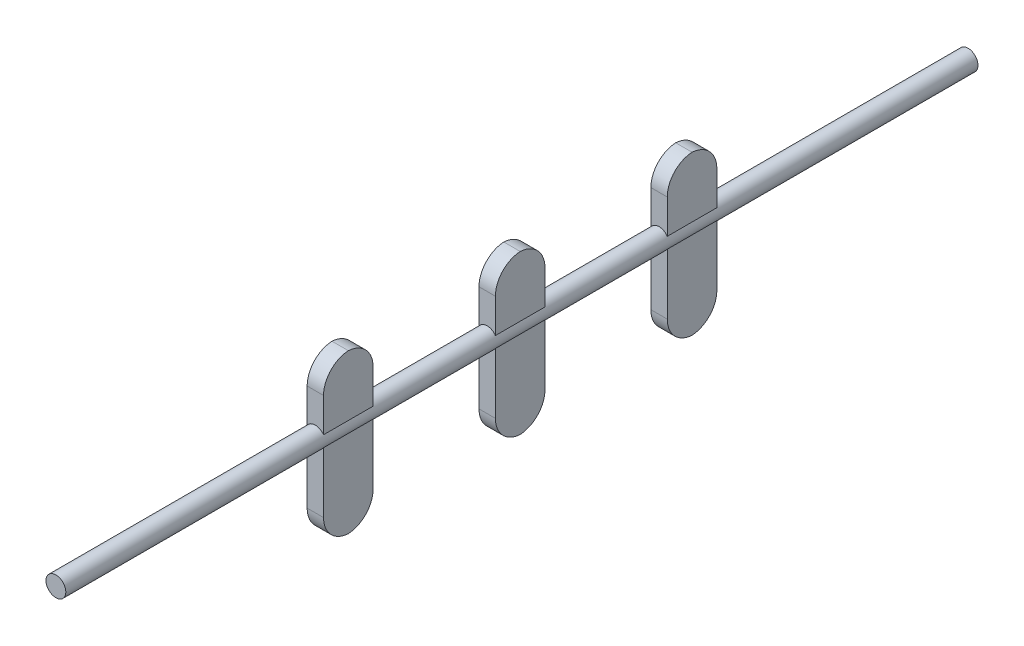
ISO-10303-21;
HEADER;
FILE_DESCRIPTION(('STEP AP214'),'2;1');
FILE_NAME('part.step','',(''),(''),'','','');
FILE_SCHEMA(('AUTOMOTIVE_DESIGN { 1 0 10303 214 1 1 1 1 }'));
ENDSEC;
DATA;
#1=APPLICATION_CONTEXT('core data for automotive mechanical design processes');
#2=APPLICATION_PROTOCOL_DEFINITION('international standard','automotive_design',2000,#1);
#3=PRODUCT_CONTEXT('',#1,'mechanical');
#4=PRODUCT('Part','Part','',(#3));
#5=PRODUCT_RELATED_PRODUCT_CATEGORY('part','',(#4));
#6=PRODUCT_DEFINITION_FORMATION('','',#4);
#7=PRODUCT_DEFINITION_CONTEXT('part definition',#1,'design');
#8=PRODUCT_DEFINITION('design','',#6,#7);
#9=PRODUCT_DEFINITION_SHAPE('','',#8);
#10=(LENGTH_UNIT() NAMED_UNIT(*) SI_UNIT(.MILLI.,.METRE.));
#11=(NAMED_UNIT(*) PLANE_ANGLE_UNIT() SI_UNIT($,.RADIAN.));
#12=(NAMED_UNIT(*) SI_UNIT($,.STERADIAN.) SOLID_ANGLE_UNIT());
#13=UNCERTAINTY_MEASURE_WITH_UNIT(LENGTH_MEASURE(1.E-05),#10,'distance_accuracy_value','');
#14=(GEOMETRIC_REPRESENTATION_CONTEXT(3) GLOBAL_UNCERTAINTY_ASSIGNED_CONTEXT((#13)) GLOBAL_UNIT_ASSIGNED_CONTEXT((#10,
#11,#12)) REPRESENTATION_CONTEXT('',''));
#15=CARTESIAN_POINT('',(0.,0.,0.));
#16=DIRECTION('',(0.,0.,1.));
#17=DIRECTION('',(1.,0.,0.));
#18=AXIS2_PLACEMENT_3D('',#15,#16,#17);
#19=CARTESIAN_POINT('',(0.,0.,438.15));
#20=DIRECTION('',(0.,0.,-1.));
#21=DIRECTION('',(-1.,0.,0.));
#22=AXIS2_PLACEMENT_3D('',#19,#20,#21);
#23=CYLINDRICAL_SURFACE('',#22,4.7625);
#24=DIRECTION('',(0.,0.,-1.));
#25=VECTOR('',#24,1.);
#26=CARTESIAN_POINT('',(-3.93682653404426,2.68007520246076,438.15));
#27=LINE('',#26,#25);
#28=CARTESIAN_POINT('',(-3.93682653404426,2.68007520246076,313.53125));
#29=VERTEX_POINT('',#28);
#30=CARTESIAN_POINT('',(-3.93682653404426,2.68007520246076,289.71875));
#31=VERTEX_POINT('',#30);
#32=EDGE_CURVE('E243',#29,#31,#27,.T.);
#33=ORIENTED_EDGE('',*,*,#32,.T.);
#34=CARTESIAN_POINT('',(0.,0.,289.71875));
#35=DIRECTION('',(0.,0.,-1.));
#36=DIRECTION('',(-1.,0.,0.));
#37=AXIS2_PLACEMENT_3D('',#34,#35,#36);
#38=CIRCLE('',#37,4.7625);
#39=CARTESIAN_POINT('',(3.93682653404426,2.68007520246076,289.71875));
#40=VERTEX_POINT('',#39);
#41=EDGE_CURVE('E238',#31,#40,#38,.T.);
#42=ORIENTED_EDGE('',*,*,#41,.T.);
#43=DIRECTION('',(0.,0.,-1.));
#44=VECTOR('',#43,1.);
#45=CARTESIAN_POINT('',(3.93682653404426,2.68007520246076,438.15));
#46=LINE('',#45,#44);
#47=CARTESIAN_POINT('',(3.93682653404426,2.68007520246076,313.53125));
#48=VERTEX_POINT('',#47);
#49=EDGE_CURVE('E231',#40,#48,#46,.F.);
#50=ORIENTED_EDGE('',*,*,#49,.T.);
#51=CARTESIAN_POINT('',(0.,0.,313.53125));
#52=DIRECTION('',(0.,0.,-1.));
#53=DIRECTION('',(-1.,0.,0.));
#54=AXIS2_PLACEMENT_3D('',#51,#52,#53);
#55=CIRCLE('',#54,4.7625);
#56=EDGE_CURVE('E235',#29,#48,#55,.T.);
#57=ORIENTED_EDGE('',*,*,#56,.F.);
#58=EDGE_LOOP('',(#33,#42,#50,#57));
#59=FACE_BOUND('',#58,.T.);
#60=DIRECTION('',(0.,0.,-1.));
#61=VECTOR('',#60,1.);
#62=CARTESIAN_POINT('',(3.93682653404426,-2.68007520246076,438.15));
#63=LINE('',#62,#61);
#64=CARTESIAN_POINT('',(3.93682653404426,-2.68007520246076,313.53125));
#65=VERTEX_POINT('',#64);
#66=CARTESIAN_POINT('',(3.93682653404426,-2.68007520246076,289.71875));
#67=VERTEX_POINT('',#66);
#68=EDGE_CURVE('E340',#65,#67,#63,.T.);
#69=ORIENTED_EDGE('',*,*,#68,.T.);
#70=CARTESIAN_POINT('',(-3.93682653404426,-2.68007520246076,289.71875));
#71=VERTEX_POINT('',#70);
#72=EDGE_CURVE('E252',#67,#71,#38,.T.);
#73=ORIENTED_EDGE('',*,*,#72,.T.);
#74=DIRECTION('',(0.,0.,-1.));
#75=VECTOR('',#74,1.);
#76=CARTESIAN_POINT('',(-3.93682653404426,-2.68007520246076,438.15));
#77=LINE('',#76,#75);
#78=CARTESIAN_POINT('',(-3.93682653404426,-2.68007520246076,313.53125));
#79=VERTEX_POINT('',#78);
#80=EDGE_CURVE('E338',#71,#79,#77,.F.);
#81=ORIENTED_EDGE('',*,*,#80,.T.);
#82=EDGE_CURVE('E254',#65,#79,#55,.T.);
#83=ORIENTED_EDGE('',*,*,#82,.F.);
#84=EDGE_LOOP('',(#69,#73,#81,#83));
#85=FACE_BOUND('',#84,.T.);
#86=DIRECTION('',(0.,0.,-1.));
#87=VECTOR('',#86,1.);
#88=CARTESIAN_POINT('',(-3.93682653404426,2.68007520246076,438.15));
#89=LINE('',#88,#87);
#90=CARTESIAN_POINT('',(-3.93682653404426,2.68007520246076,148.43125));
#91=VERTEX_POINT('',#90);
#92=CARTESIAN_POINT('',(-3.93682653404426,2.68007520246076,124.61875));
#93=VERTEX_POINT('',#92);
#94=EDGE_CURVE('E332',#91,#93,#89,.T.);
#95=ORIENTED_EDGE('',*,*,#94,.T.);
#96=CARTESIAN_POINT('',(0.,0.,124.61875));
#97=DIRECTION('',(0.,0.,-1.));
#98=DIRECTION('',(-1.,0.,0.));
#99=AXIS2_PLACEMENT_3D('',#96,#97,#98);
#100=CIRCLE('',#99,4.7625);
#101=CARTESIAN_POINT('',(3.93682653404426,2.68007520246076,124.61875));
#102=VERTEX_POINT('',#101);
#103=EDGE_CURVE('E331',#93,#102,#100,.T.);
#104=ORIENTED_EDGE('',*,*,#103,.T.);
#105=DIRECTION('',(0.,0.,-1.));
#106=VECTOR('',#105,1.);
#107=CARTESIAN_POINT('',(3.93682653404426,2.68007520246076,438.15));
#108=LINE('',#107,#106);
#109=CARTESIAN_POINT('',(3.93682653404426,2.68007520246076,148.43125));
#110=VERTEX_POINT('',#109);
#111=EDGE_CURVE('E335',#102,#110,#108,.F.);
#112=ORIENTED_EDGE('',*,*,#111,.T.);
#113=CARTESIAN_POINT('',(0.,0.,148.43125));
#114=DIRECTION('',(0.,0.,-1.));
#115=DIRECTION('',(-1.,0.,0.));
#116=AXIS2_PLACEMENT_3D('',#113,#114,#115);
#117=CIRCLE('',#116,4.7625);
#118=EDGE_CURVE('E324',#91,#110,#117,.T.);
#119=ORIENTED_EDGE('',*,*,#118,.F.);
#120=EDGE_LOOP('',(#95,#104,#112,#119));
#121=FACE_BOUND('',#120,.T.);
#122=DIRECTION('',(0.,0.,-1.));
#123=VECTOR('',#122,1.);
#124=CARTESIAN_POINT('',(3.93682653404426,-2.68007520246076,438.15));
#125=LINE('',#124,#123);
#126=CARTESIAN_POINT('',(3.93682653404426,-2.68007520246076,148.43125));
#127=VERTEX_POINT('',#126);
#128=CARTESIAN_POINT('',(3.93682653404426,-2.68007520246076,124.61875));
#129=VERTEX_POINT('',#128);
#130=EDGE_CURVE('E326',#127,#129,#125,.T.);
#131=ORIENTED_EDGE('',*,*,#130,.T.);
#132=CARTESIAN_POINT('',(-3.93682653404426,-2.68007520246076,124.61875));
#133=VERTEX_POINT('',#132);
#134=EDGE_CURVE('E329',#129,#133,#100,.T.);
#135=ORIENTED_EDGE('',*,*,#134,.T.);
#136=DIRECTION('',(0.,0.,-1.));
#137=VECTOR('',#136,1.);
#138=CARTESIAN_POINT('',(-3.93682653404426,-2.68007520246076,438.15));
#139=LINE('',#138,#137);
#140=CARTESIAN_POINT('',(-3.93682653404426,-2.68007520246076,148.43125));
#141=VERTEX_POINT('',#140);
#142=EDGE_CURVE('E323',#133,#141,#139,.F.);
#143=ORIENTED_EDGE('',*,*,#142,.T.);
#144=EDGE_CURVE('E320',#127,#141,#117,.T.);
#145=ORIENTED_EDGE('',*,*,#144,.F.);
#146=EDGE_LOOP('',(#131,#135,#143,#145));
#147=FACE_BOUND('',#146,.T.);
#148=DIRECTION('',(0.,0.,-1.));
#149=VECTOR('',#148,1.);
#150=CARTESIAN_POINT('',(-3.93682653404426,2.68007520246076,438.15));
#151=LINE('',#150,#149);
#152=CARTESIAN_POINT('',(-3.93682653404426,2.68007520246076,230.98125));
#153=VERTEX_POINT('',#152);
#154=CARTESIAN_POINT('',(-3.93682653404426,2.68007520246076,207.16875));
#155=VERTEX_POINT('',#154);
#156=EDGE_CURVE('E315',#153,#155,#151,.T.);
#157=ORIENTED_EDGE('',*,*,#156,.T.);
#158=CARTESIAN_POINT('',(0.,0.,207.16875));
#159=DIRECTION('',(0.,0.,-1.));
#160=DIRECTION('',(-1.,0.,0.));
#161=AXIS2_PLACEMENT_3D('',#158,#159,#160);
#162=CIRCLE('',#161,4.7625);
#163=CARTESIAN_POINT('',(3.93682653404426,2.68007520246076,207.16875));
#164=VERTEX_POINT('',#163);
#165=EDGE_CURVE('E314',#155,#164,#162,.T.);
#166=ORIENTED_EDGE('',*,*,#165,.T.);
#167=DIRECTION('',(0.,0.,-1.));
#168=VECTOR('',#167,1.);
#169=CARTESIAN_POINT('',(3.93682653404426,2.68007520246076,438.15));
#170=LINE('',#169,#168);
#171=CARTESIAN_POINT('',(3.93682653404426,2.68007520246076,230.98125));
#172=VERTEX_POINT('',#171);
#173=EDGE_CURVE('E318',#164,#172,#170,.F.);
#174=ORIENTED_EDGE('',*,*,#173,.T.);
#175=CARTESIAN_POINT('',(0.,0.,230.98125));
#176=DIRECTION('',(0.,0.,-1.));
#177=DIRECTION('',(-1.,0.,0.));
#178=AXIS2_PLACEMENT_3D('',#175,#176,#177);
#179=CIRCLE('',#178,4.7625);
#180=EDGE_CURVE('E307',#153,#172,#179,.T.);
#181=ORIENTED_EDGE('',*,*,#180,.F.);
#182=EDGE_LOOP('',(#157,#166,#174,#181));
#183=FACE_BOUND('',#182,.T.);
#184=DIRECTION('',(0.,0.,-1.));
#185=VECTOR('',#184,1.);
#186=CARTESIAN_POINT('',(3.93682653404426,-2.68007520246076,438.15));
#187=LINE('',#186,#185);
#188=CARTESIAN_POINT('',(3.93682653404426,-2.68007520246076,230.98125));
#189=VERTEX_POINT('',#188);
#190=CARTESIAN_POINT('',(3.93682653404426,-2.68007520246076,207.16875));
#191=VERTEX_POINT('',#190);
#192=EDGE_CURVE('E309',#189,#191,#187,.T.);
#193=ORIENTED_EDGE('',*,*,#192,.T.);
#194=CARTESIAN_POINT('',(-3.93682653404426,-2.68007520246076,207.16875));
#195=VERTEX_POINT('',#194);
#196=EDGE_CURVE('E312',#191,#195,#162,.T.);
#197=ORIENTED_EDGE('',*,*,#196,.T.);
#198=DIRECTION('',(0.,0.,-1.));
#199=VECTOR('',#198,1.);
#200=CARTESIAN_POINT('',(-3.93682653404426,-2.68007520246076,438.15));
#201=LINE('',#200,#199);
#202=CARTESIAN_POINT('',(-3.93682653404426,-2.68007520246076,230.98125));
#203=VERTEX_POINT('',#202);
#204=EDGE_CURVE('E306',#195,#203,#201,.F.);
#205=ORIENTED_EDGE('',*,*,#204,.T.);
#206=EDGE_CURVE('E301',#189,#203,#179,.T.);
#207=ORIENTED_EDGE('',*,*,#206,.F.);
#208=EDGE_LOOP('',(#193,#197,#205,#207));
#209=FACE_BOUND('',#208,.T.);
#210=CARTESIAN_POINT('',(0.,0.,438.15));
#211=DIRECTION('',(0.,0.,1.));
#212=DIRECTION('',(1.,0.,0.));
#213=AXIS2_PLACEMENT_3D('',#210,#211,#212);
#214=CIRCLE('',#213,4.7625);
#215=CARTESIAN_POINT('',(4.7625,0.,438.15));
#216=VERTEX_POINT('',#215);
#217=EDGE_CURVE('E298',#216,#216,#214,.T.);
#218=ORIENTED_EDGE('',*,*,#217,.F.);
#219=EDGE_LOOP('',(#218));
#220=FACE_BOUND('',#219,.T.);
#221=CARTESIAN_POINT('',(0.,0.,0.));
#222=DIRECTION('',(0.,0.,1.));
#223=DIRECTION('',(1.,0.,0.));
#224=AXIS2_PLACEMENT_3D('',#221,#222,#223);
#225=CIRCLE('',#224,4.7625);
#226=CARTESIAN_POINT('',(4.7625,0.,0.));
#227=VERTEX_POINT('',#226);
#228=EDGE_CURVE('E297',#227,#227,#225,.T.);
#229=ORIENTED_EDGE('',*,*,#228,.T.);
#230=EDGE_LOOP('',(#229));
#231=FACE_BOUND('',#230,.T.);
#232=ADVANCED_FACE('F35',(#59,#85,#121,#147,#183,#209,#220,#231),#23,.T.);
#233=CARTESIAN_POINT('',(0.,0.,438.15));
#234=DIRECTION('',(0.,0.,1.));
#235=DIRECTION('',(1.,0.,0.));
#236=AXIS2_PLACEMENT_3D('',#233,#234,#235);
#237=PLANE('',#236);
#238=ORIENTED_EDGE('',*,*,#217,.T.);
#239=EDGE_LOOP('',(#238));
#240=FACE_BOUND('',#239,.T.);
#241=ADVANCED_FACE('F468',(#240),#237,.T.);
#242=CARTESIAN_POINT('',(0.,0.,0.));
#243=DIRECTION('',(0.,0.,1.));
#244=DIRECTION('',(1.,0.,0.));
#245=AXIS2_PLACEMENT_3D('',#242,#243,#244);
#246=PLANE('',#245);
#247=ORIENTED_EDGE('',*,*,#228,.F.);
#248=EDGE_LOOP('',(#247));
#249=FACE_BOUND('',#248,.T.);
#250=ADVANCED_FACE('F473',(#249),#246,.F.);
#251=CARTESIAN_POINT('',(0.,0.,230.98125));
#252=DIRECTION('',(0.,0.,-1.));
#253=DIRECTION('',(-1.,0.,0.));
#254=AXIS2_PLACEMENT_3D('',#251,#252,#253);
#255=PLANE('',#254);
#256=DIRECTION('',(0.,-1.,0.));
#257=VECTOR('',#256,1.);
#258=CARTESIAN_POINT('',(-3.93682653404426,-44.45,230.98125));
#259=LINE('',#258,#257);
#260=CARTESIAN_POINT('',(-3.93682653404426,-31.75,230.98125));
#261=VERTEX_POINT('',#260);
#262=EDGE_CURVE('E288',#203,#261,#259,.T.);
#263=ORIENTED_EDGE('',*,*,#262,.T.);
#264=DIRECTION('',(1.,0.,0.));
#265=VECTOR('',#264,1.);
#266=CARTESIAN_POINT('',(3.93682653404426,-31.75,230.98125));
#267=LINE('',#266,#265);
#268=CARTESIAN_POINT('',(3.93682653404426,-31.75,230.98125));
#269=VERTEX_POINT('',#268);
#270=EDGE_CURVE('E399',#261,#269,#267,.T.);
#271=ORIENTED_EDGE('',*,*,#270,.T.);
#272=DIRECTION('',(0.,1.,0.));
#273=VECTOR('',#272,1.);
#274=CARTESIAN_POINT('',(3.93682653404426,-44.45,230.98125));
#275=LINE('',#274,#273);
#276=EDGE_CURVE('E286',#269,#189,#275,.T.);
#277=ORIENTED_EDGE('',*,*,#276,.T.);
#278=ORIENTED_EDGE('',*,*,#206,.T.);
#279=EDGE_LOOP('',(#263,#271,#277,#278));
#280=FACE_BOUND('',#279,.T.);
#281=ADVANCED_FACE('F684',(#280),#255,.F.);
#282=CARTESIAN_POINT('',(0.,0.,207.16875));
#283=DIRECTION('',(0.,0.,-1.));
#284=DIRECTION('',(-1.,0.,0.));
#285=AXIS2_PLACEMENT_3D('',#282,#283,#284);
#286=PLANE('',#285);
#287=DIRECTION('',(0.,1.,0.));
#288=VECTOR('',#287,1.);
#289=CARTESIAN_POINT('',(3.93682653404426,-44.45,207.16875));
#290=LINE('',#289,#288);
#291=CARTESIAN_POINT('',(3.93682653404426,-31.75,207.16875));
#292=VERTEX_POINT('',#291);
#293=EDGE_CURVE('E292',#292,#191,#290,.T.);
#294=ORIENTED_EDGE('',*,*,#293,.F.);
#295=DIRECTION('',(1.,0.,0.));
#296=VECTOR('',#295,1.);
#297=CARTESIAN_POINT('',(0.,-31.75,207.16875));
#298=LINE('',#297,#296);
#299=CARTESIAN_POINT('',(-3.93682653404426,-31.75,207.16875));
#300=VERTEX_POINT('',#299);
#301=EDGE_CURVE('E416',#292,#300,#298,.F.);
#302=ORIENTED_EDGE('',*,*,#301,.T.);
#303=DIRECTION('',(0.,-1.,0.));
#304=VECTOR('',#303,1.);
#305=CARTESIAN_POINT('',(-3.93682653404426,-44.45,207.16875));
#306=LINE('',#305,#304);
#307=EDGE_CURVE('E294',#195,#300,#306,.T.);
#308=ORIENTED_EDGE('',*,*,#307,.F.);
#309=ORIENTED_EDGE('',*,*,#196,.F.);
#310=EDGE_LOOP('',(#294,#302,#308,#309));
#311=FACE_BOUND('',#310,.T.);
#312=ADVANCED_FACE('F690',(#311),#286,.T.);
#313=CARTESIAN_POINT('',(-3.93682653404426,-44.45,207.16875));
#314=DIRECTION('',(-1.,0.,0.));
#315=DIRECTION('',(0.,0.,1.));
#316=AXIS2_PLACEMENT_3D('',#313,#314,#315);
#317=PLANE('',#316);
#318=CARTESIAN_POINT('',(-3.93682653404426,-31.75,219.86875));
#319=DIRECTION('',(-1.,0.,0.));
#320=DIRECTION('',(0.,0.,1.));
#321=AXIS2_PLACEMENT_3D('',#318,#319,#320);
#322=CIRCLE('',#321,12.7);
#323=CARTESIAN_POINT('',(-3.93682653404426,-44.4251710417454,219.075));
#324=VERTEX_POINT('',#323);
#325=EDGE_CURVE('E412',#300,#324,#322,.T.);
#326=ORIENTED_EDGE('',*,*,#325,.T.);
#327=CARTESIAN_POINT('',(-3.93682653404426,-31.75,218.28125));
#328=DIRECTION('',(-1.,0.,0.));
#329=DIRECTION('',(0.,0.,1.));
#330=AXIS2_PLACEMENT_3D('',#327,#328,#329);
#331=CIRCLE('',#330,12.7);
#332=EDGE_CURVE('E414',#324,#261,#331,.T.);
#333=ORIENTED_EDGE('',*,*,#332,.T.);
#334=ORIENTED_EDGE('',*,*,#262,.F.);
#335=ORIENTED_EDGE('',*,*,#204,.F.);
#336=ORIENTED_EDGE('',*,*,#307,.T.);
#337=EDGE_LOOP('',(#326,#333,#334,#335,#336));
#338=FACE_BOUND('',#337,.T.);
#339=ADVANCED_FACE('F464',(#338),#317,.T.);
#340=CARTESIAN_POINT('',(3.93682653404426,-44.45,207.16875));
#341=DIRECTION('',(1.,0.,0.));
#342=DIRECTION('',(0.,0.,-1.));
#343=AXIS2_PLACEMENT_3D('',#340,#341,#342);
#344=PLANE('',#343);
#345=ORIENTED_EDGE('',*,*,#276,.F.);
#346=CARTESIAN_POINT('',(3.93682653404426,-31.75,218.28125));
#347=DIRECTION('',(1.,0.,0.));
#348=DIRECTION('',(0.,0.,-1.));
#349=AXIS2_PLACEMENT_3D('',#346,#347,#348);
#350=CIRCLE('',#349,12.7);
#351=CARTESIAN_POINT('',(3.93682653404426,-44.4251710417454,219.075));
#352=VERTEX_POINT('',#351);
#353=EDGE_CURVE('E410',#269,#352,#350,.T.);
#354=ORIENTED_EDGE('',*,*,#353,.T.);
#355=CARTESIAN_POINT('',(3.93682653404426,-31.75,219.86875));
#356=DIRECTION('',(1.,0.,0.));
#357=DIRECTION('',(0.,0.,-1.));
#358=AXIS2_PLACEMENT_3D('',#355,#356,#357);
#359=CIRCLE('',#358,12.7);
#360=EDGE_CURVE('E408',#352,#292,#359,.T.);
#361=ORIENTED_EDGE('',*,*,#360,.T.);
#362=ORIENTED_EDGE('',*,*,#293,.T.);
#363=ORIENTED_EDGE('',*,*,#192,.F.);
#364=EDGE_LOOP('',(#345,#354,#361,#362,#363));
#365=FACE_BOUND('',#364,.T.);
#366=ADVANCED_FACE('F457',(#365),#344,.T.);
#367=CARTESIAN_POINT('',(3.93682653404426,19.05,207.16875));
#368=VERTEX_POINT('',#367);
#369=EDGE_CURVE('E291',#164,#368,#290,.T.);
#370=ORIENTED_EDGE('',*,*,#369,.T.);
#371=CARTESIAN_POINT('',(3.93682653404426,19.05,219.86875));
#372=DIRECTION('',(1.,0.,0.));
#373=DIRECTION('',(0.,0.,-1.));
#374=AXIS2_PLACEMENT_3D('',#371,#372,#373);
#375=CIRCLE('',#374,12.7);
#376=CARTESIAN_POINT('',(3.93682653404426,31.7251710417454,219.075));
#377=VERTEX_POINT('',#376);
#378=EDGE_CURVE('E44',#368,#377,#375,.T.);
#379=ORIENTED_EDGE('',*,*,#378,.T.);
#380=CARTESIAN_POINT('',(3.93682653404426,19.05,218.28125));
#381=DIRECTION('',(1.,0.,0.));
#382=DIRECTION('',(0.,0.,-1.));
#383=AXIS2_PLACEMENT_3D('',#380,#381,#382);
#384=CIRCLE('',#383,12.7);
#385=CARTESIAN_POINT('',(3.93682653404426,19.05,230.98125));
#386=VERTEX_POINT('',#385);
#387=EDGE_CURVE('E55',#377,#386,#384,.T.);
#388=ORIENTED_EDGE('',*,*,#387,.T.);
#389=EDGE_CURVE('E285',#172,#386,#275,.T.);
#390=ORIENTED_EDGE('',*,*,#389,.F.);
#391=ORIENTED_EDGE('',*,*,#173,.F.);
#392=EDGE_LOOP('',(#370,#379,#388,#390,#391));
#393=FACE_BOUND('',#392,.T.);
#394=ADVANCED_FACE('F455',(#393),#344,.T.);
#395=CARTESIAN_POINT('',(-3.93682653404426,19.05,218.28125));
#396=DIRECTION('',(-1.,0.,0.));
#397=DIRECTION('',(0.,0.,1.));
#398=AXIS2_PLACEMENT_3D('',#395,#396,#397);
#399=CIRCLE('',#398,12.7);
#400=CARTESIAN_POINT('',(-3.93682653404426,19.05,230.98125));
#401=VERTEX_POINT('',#400);
#402=CARTESIAN_POINT('',(-3.93682653404426,31.7251710417454,219.075));
#403=VERTEX_POINT('',#402);
#404=EDGE_CURVE('E418',#401,#403,#399,.T.);
#405=ORIENTED_EDGE('',*,*,#404,.T.);
#406=CARTESIAN_POINT('',(-3.93682653404426,19.05,219.86875));
#407=DIRECTION('',(-1.,0.,0.));
#408=DIRECTION('',(0.,0.,1.));
#409=AXIS2_PLACEMENT_3D('',#406,#407,#408);
#410=CIRCLE('',#409,12.7);
#411=CARTESIAN_POINT('',(-3.93682653404426,19.05,207.16875));
#412=VERTEX_POINT('',#411);
#413=EDGE_CURVE('E420',#403,#412,#410,.T.);
#414=ORIENTED_EDGE('',*,*,#413,.T.);
#415=EDGE_CURVE('E295',#412,#155,#306,.T.);
#416=ORIENTED_EDGE('',*,*,#415,.T.);
#417=ORIENTED_EDGE('',*,*,#156,.F.);
#418=EDGE_CURVE('E289',#401,#153,#259,.T.);
#419=ORIENTED_EDGE('',*,*,#418,.F.);
#420=EDGE_LOOP('',(#405,#414,#416,#417,#419));
#421=FACE_BOUND('',#420,.T.);
#422=ADVANCED_FACE('F446',(#421),#317,.T.);
#423=ORIENTED_EDGE('',*,*,#415,.F.);
#424=DIRECTION('',(-1.,0.,0.));
#425=VECTOR('',#424,1.);
#426=CARTESIAN_POINT('',(0.,19.05,207.16875));
#427=LINE('',#426,#425);
#428=EDGE_CURVE('E422',#412,#368,#427,.F.);
#429=ORIENTED_EDGE('',*,*,#428,.T.);
#430=ORIENTED_EDGE('',*,*,#369,.F.);
#431=ORIENTED_EDGE('',*,*,#165,.F.);
#432=EDGE_LOOP('',(#423,#429,#430,#431));
#433=FACE_BOUND('',#432,.T.);
#434=ADVANCED_FACE('F454',(#433),#286,.T.);
#435=ORIENTED_EDGE('',*,*,#389,.T.);
#436=DIRECTION('',(-1.,0.,0.));
#437=VECTOR('',#436,1.);
#438=CARTESIAN_POINT('',(-3.93682653404426,19.05,230.98125));
#439=LINE('',#438,#437);
#440=EDGE_CURVE('E11',#386,#401,#439,.T.);
#441=ORIENTED_EDGE('',*,*,#440,.T.);
#442=ORIENTED_EDGE('',*,*,#418,.T.);
#443=ORIENTED_EDGE('',*,*,#180,.T.);
#444=EDGE_LOOP('',(#435,#441,#442,#443));
#445=FACE_BOUND('',#444,.T.);
#446=ADVANCED_FACE('F441',(#445),#255,.F.);
#447=CARTESIAN_POINT('',(0.,0.,148.43125));
#448=DIRECTION('',(0.,0.,-1.));
#449=DIRECTION('',(-1.,0.,0.));
#450=AXIS2_PLACEMENT_3D('',#447,#448,#449);
#451=PLANE('',#450);
#452=DIRECTION('',(0.,-1.,0.));
#453=VECTOR('',#452,1.);
#454=CARTESIAN_POINT('',(-3.93682653404426,-44.45,148.43125));
#455=LINE('',#454,#453);
#456=CARTESIAN_POINT('',(-3.93682653404426,-31.75,148.43125));
#457=VERTEX_POINT('',#456);
#458=EDGE_CURVE('E276',#141,#457,#455,.T.);
#459=ORIENTED_EDGE('',*,*,#458,.T.);
#460=DIRECTION('',(1.,0.,0.));
#461=VECTOR('',#460,1.);
#462=CARTESIAN_POINT('',(3.93682653404426,-31.75,148.43125));
#463=LINE('',#462,#461);
#464=CARTESIAN_POINT('',(3.93682653404426,-31.75,148.43125));
#465=VERTEX_POINT('',#464);
#466=EDGE_CURVE('E345',#457,#465,#463,.T.);
#467=ORIENTED_EDGE('',*,*,#466,.T.);
#468=DIRECTION('',(0.,1.,0.));
#469=VECTOR('',#468,1.);
#470=CARTESIAN_POINT('',(3.93682653404426,-44.45,148.43125));
#471=LINE('',#470,#469);
#472=EDGE_CURVE('E274',#465,#127,#471,.T.);
#473=ORIENTED_EDGE('',*,*,#472,.T.);
#474=ORIENTED_EDGE('',*,*,#144,.T.);
#475=EDGE_LOOP('',(#459,#467,#473,#474));
#476=FACE_BOUND('',#475,.T.);
#477=ADVANCED_FACE('F627',(#476),#451,.F.);
#478=CARTESIAN_POINT('',(0.,0.,124.61875));
#479=DIRECTION('',(0.,0.,-1.));
#480=DIRECTION('',(-1.,0.,0.));
#481=AXIS2_PLACEMENT_3D('',#478,#479,#480);
#482=PLANE('',#481);
#483=DIRECTION('',(0.,1.,0.));
#484=VECTOR('',#483,1.);
#485=CARTESIAN_POINT('',(3.93682653404426,-44.45,124.61875));
#486=LINE('',#485,#484);
#487=CARTESIAN_POINT('',(3.93682653404426,-31.75,124.61875));
#488=VERTEX_POINT('',#487);
#489=EDGE_CURVE('E280',#488,#129,#486,.T.);
#490=ORIENTED_EDGE('',*,*,#489,.F.);
#491=DIRECTION('',(1.,0.,0.));
#492=VECTOR('',#491,1.);
#493=CARTESIAN_POINT('',(0.,-31.75,124.61875));
#494=LINE('',#493,#492);
#495=CARTESIAN_POINT('',(-3.93682653404426,-31.75,124.61875));
#496=VERTEX_POINT('',#495);
#497=EDGE_CURVE('E356',#488,#496,#494,.F.);
#498=ORIENTED_EDGE('',*,*,#497,.T.);
#499=DIRECTION('',(0.,-1.,0.));
#500=VECTOR('',#499,1.);
#501=CARTESIAN_POINT('',(-3.93682653404426,-44.45,124.61875));
#502=LINE('',#501,#500);
#503=EDGE_CURVE('E282',#133,#496,#502,.T.);
#504=ORIENTED_EDGE('',*,*,#503,.F.);
#505=ORIENTED_EDGE('',*,*,#134,.F.);
#506=EDGE_LOOP('',(#490,#498,#504,#505));
#507=FACE_BOUND('',#506,.T.);
#508=ADVANCED_FACE('F636',(#507),#482,.T.);
#509=CARTESIAN_POINT('',(-3.93682653404426,-44.45,124.61875));
#510=DIRECTION('',(-1.,0.,0.));
#511=DIRECTION('',(0.,0.,1.));
#512=AXIS2_PLACEMENT_3D('',#509,#510,#511);
#513=PLANE('',#512);
#514=CARTESIAN_POINT('',(-3.93682653404426,-31.75,137.31875));
#515=DIRECTION('',(-1.,0.,0.));
#516=DIRECTION('',(0.,0.,1.));
#517=AXIS2_PLACEMENT_3D('',#514,#515,#516);
#518=CIRCLE('',#517,12.7);
#519=CARTESIAN_POINT('',(-3.93682653404426,-44.4251710417454,136.525));
#520=VERTEX_POINT('',#519);
#521=EDGE_CURVE('E352',#496,#520,#518,.T.);
#522=ORIENTED_EDGE('',*,*,#521,.T.);
#523=CARTESIAN_POINT('',(-3.93682653404426,-31.75,135.73125));
#524=DIRECTION('',(-1.,0.,0.));
#525=DIRECTION('',(0.,0.,1.));
#526=AXIS2_PLACEMENT_3D('',#523,#524,#525);
#527=CIRCLE('',#526,12.7);
#528=EDGE_CURVE('E354',#520,#457,#527,.T.);
#529=ORIENTED_EDGE('',*,*,#528,.T.);
#530=ORIENTED_EDGE('',*,*,#458,.F.);
#531=ORIENTED_EDGE('',*,*,#142,.F.);
#532=ORIENTED_EDGE('',*,*,#503,.T.);
#533=EDGE_LOOP('',(#522,#529,#530,#531,#532));
#534=FACE_BOUND('',#533,.T.);
#535=ADVANCED_FACE('F645',(#534),#513,.T.);
#536=CARTESIAN_POINT('',(3.93682653404426,-44.45,124.61875));
#537=DIRECTION('',(1.,0.,0.));
#538=DIRECTION('',(0.,0.,-1.));
#539=AXIS2_PLACEMENT_3D('',#536,#537,#538);
#540=PLANE('',#539);
#541=ORIENTED_EDGE('',*,*,#472,.F.);
#542=CARTESIAN_POINT('',(3.93682653404426,-31.75,135.73125));
#543=DIRECTION('',(1.,0.,0.));
#544=DIRECTION('',(0.,0.,-1.));
#545=AXIS2_PLACEMENT_3D('',#542,#543,#544);
#546=CIRCLE('',#545,12.7);
#547=CARTESIAN_POINT('',(3.93682653404426,-44.4251710417454,136.525));
#548=VERTEX_POINT('',#547);
#549=EDGE_CURVE('E350',#465,#548,#546,.T.);
#550=ORIENTED_EDGE('',*,*,#549,.T.);
#551=CARTESIAN_POINT('',(3.93682653404426,-31.75,137.31875));
#552=DIRECTION('',(1.,0.,0.));
#553=DIRECTION('',(0.,0.,-1.));
#554=AXIS2_PLACEMENT_3D('',#551,#552,#553);
#555=CIRCLE('',#554,12.7);
#556=EDGE_CURVE('E348',#548,#488,#555,.T.);
#557=ORIENTED_EDGE('',*,*,#556,.T.);
#558=ORIENTED_EDGE('',*,*,#489,.T.);
#559=ORIENTED_EDGE('',*,*,#130,.F.);
#560=EDGE_LOOP('',(#541,#550,#557,#558,#559));
#561=FACE_BOUND('',#560,.T.);
#562=ADVANCED_FACE('F651',(#561),#540,.T.);
#563=CARTESIAN_POINT('',(3.93682653404426,19.05,124.61875));
#564=VERTEX_POINT('',#563);
#565=EDGE_CURVE('E279',#102,#564,#486,.T.);
#566=ORIENTED_EDGE('',*,*,#565,.T.);
#567=CARTESIAN_POINT('',(3.93682653404426,19.05,137.31875));
#568=DIRECTION('',(1.,0.,0.));
#569=DIRECTION('',(0.,0.,-1.));
#570=AXIS2_PLACEMENT_3D('',#567,#568,#569);
#571=CIRCLE('',#570,12.7);
#572=CARTESIAN_POINT('',(3.93682653404426,31.7251710417454,136.525));
#573=VERTEX_POINT('',#572);
#574=EDGE_CURVE('E367',#564,#573,#571,.T.);
#575=ORIENTED_EDGE('',*,*,#574,.T.);
#576=CARTESIAN_POINT('',(3.93682653404426,19.05,135.73125));
#577=DIRECTION('',(1.,0.,0.));
#578=DIRECTION('',(0.,0.,-1.));
#579=AXIS2_PLACEMENT_3D('',#576,#577,#578);
#580=CIRCLE('',#579,12.7);
#581=CARTESIAN_POINT('',(3.93682653404426,19.05,148.43125));
#582=VERTEX_POINT('',#581);
#583=EDGE_CURVE('E365',#573,#582,#580,.T.);
#584=ORIENTED_EDGE('',*,*,#583,.T.);
#585=EDGE_CURVE('E273',#110,#582,#471,.T.);
#586=ORIENTED_EDGE('',*,*,#585,.F.);
#587=ORIENTED_EDGE('',*,*,#111,.F.);
#588=EDGE_LOOP('',(#566,#575,#584,#586,#587));
#589=FACE_BOUND('',#588,.T.);
#590=ADVANCED_FACE('F642',(#589),#540,.T.);
#591=CARTESIAN_POINT('',(-3.93682653404426,19.05,135.73125));
#592=DIRECTION('',(-1.,0.,0.));
#593=DIRECTION('',(0.,0.,1.));
#594=AXIS2_PLACEMENT_3D('',#591,#592,#593);
#595=CIRCLE('',#594,12.7);
#596=CARTESIAN_POINT('',(-3.93682653404426,19.05,148.43125));
#597=VERTEX_POINT('',#596);
#598=CARTESIAN_POINT('',(-3.93682653404426,31.7251710417454,136.525));
#599=VERTEX_POINT('',#598);
#600=EDGE_CURVE('E358',#597,#599,#595,.T.);
#601=ORIENTED_EDGE('',*,*,#600,.T.);
#602=CARTESIAN_POINT('',(-3.93682653404426,19.05,137.31875));
#603=DIRECTION('',(-1.,0.,0.));
#604=DIRECTION('',(0.,0.,1.));
#605=AXIS2_PLACEMENT_3D('',#602,#603,#604);
#606=CIRCLE('',#605,12.7);
#607=CARTESIAN_POINT('',(-3.93682653404426,19.05,124.61875));
#608=VERTEX_POINT('',#607);
#609=EDGE_CURVE('E360',#599,#608,#606,.T.);
#610=ORIENTED_EDGE('',*,*,#609,.T.);
#611=EDGE_CURVE('E283',#608,#93,#502,.T.);
#612=ORIENTED_EDGE('',*,*,#611,.T.);
#613=ORIENTED_EDGE('',*,*,#94,.F.);
#614=EDGE_CURVE('E277',#597,#91,#455,.T.);
#615=ORIENTED_EDGE('',*,*,#614,.F.);
#616=EDGE_LOOP('',(#601,#610,#612,#613,#615));
#617=FACE_BOUND('',#616,.T.);
#618=ADVANCED_FACE('F633',(#617),#513,.T.);
#619=ORIENTED_EDGE('',*,*,#611,.F.);
#620=DIRECTION('',(-1.,0.,0.));
#621=VECTOR('',#620,1.);
#622=CARTESIAN_POINT('',(0.,19.05,124.61875));
#623=LINE('',#622,#621);
#624=EDGE_CURVE('E362',#608,#564,#623,.F.);
#625=ORIENTED_EDGE('',*,*,#624,.T.);
#626=ORIENTED_EDGE('',*,*,#565,.F.);
#627=ORIENTED_EDGE('',*,*,#103,.F.);
#628=EDGE_LOOP('',(#619,#625,#626,#627));
#629=FACE_BOUND('',#628,.T.);
#630=ADVANCED_FACE('F624',(#629),#482,.T.);
#631=ORIENTED_EDGE('',*,*,#585,.T.);
#632=DIRECTION('',(-1.,0.,0.));
#633=VECTOR('',#632,1.);
#634=CARTESIAN_POINT('',(-3.93682653404426,19.05,148.43125));
#635=LINE('',#634,#633);
#636=EDGE_CURVE('E369',#582,#597,#635,.T.);
#637=ORIENTED_EDGE('',*,*,#636,.T.);
#638=ORIENTED_EDGE('',*,*,#614,.T.);
#639=ORIENTED_EDGE('',*,*,#118,.T.);
#640=EDGE_LOOP('',(#631,#637,#638,#639));
#641=FACE_BOUND('',#640,.T.);
#642=ADVANCED_FACE('F617',(#641),#451,.F.);
#643=CARTESIAN_POINT('',(0.,0.,313.53125));
#644=DIRECTION('',(0.,0.,-1.));
#645=DIRECTION('',(-1.,0.,0.));
#646=AXIS2_PLACEMENT_3D('',#643,#644,#645);
#647=PLANE('',#646);
#648=DIRECTION('',(0.,-1.,0.));
#649=VECTOR('',#648,1.);
#650=CARTESIAN_POINT('',(-3.93682653404426,-44.45,313.53125));
#651=LINE('',#650,#649);
#652=CARTESIAN_POINT('',(-3.93682653404426,-31.75,313.53125));
#653=VERTEX_POINT('',#652);
#654=EDGE_CURVE('E261',#79,#653,#651,.T.);
#655=ORIENTED_EDGE('',*,*,#654,.T.);
#656=DIRECTION('',(1.,0.,0.));
#657=VECTOR('',#656,1.);
#658=CARTESIAN_POINT('',(3.93682653404426,-31.75,313.53125));
#659=LINE('',#658,#657);
#660=CARTESIAN_POINT('',(3.93682653404426,-31.75,313.53125));
#661=VERTEX_POINT('',#660);
#662=EDGE_CURVE('E370',#653,#661,#659,.T.);
#663=ORIENTED_EDGE('',*,*,#662,.T.);
#664=DIRECTION('',(0.,1.,0.));
#665=VECTOR('',#664,1.);
#666=CARTESIAN_POINT('',(3.93682653404426,-44.45,313.53125));
#667=LINE('',#666,#665);
#668=EDGE_CURVE('E258',#661,#65,#667,.T.);
#669=ORIENTED_EDGE('',*,*,#668,.T.);
#670=ORIENTED_EDGE('',*,*,#82,.T.);
#671=EDGE_LOOP('',(#655,#663,#669,#670));
#672=FACE_BOUND('',#671,.T.);
#673=ADVANCED_FACE('F569',(#672),#647,.F.);
#674=CARTESIAN_POINT('',(0.,0.,289.71875));
#675=DIRECTION('',(0.,0.,-1.));
#676=DIRECTION('',(-1.,0.,0.));
#677=AXIS2_PLACEMENT_3D('',#674,#675,#676);
#678=PLANE('',#677);
#679=DIRECTION('',(0.,1.,0.));
#680=VECTOR('',#679,1.);
#681=CARTESIAN_POINT('',(3.93682653404426,-44.45,289.71875));
#682=LINE('',#681,#680);
#683=CARTESIAN_POINT('',(3.93682653404426,-31.75,289.71875));
#684=VERTEX_POINT('',#683);
#685=EDGE_CURVE('E268',#684,#67,#682,.T.);
#686=ORIENTED_EDGE('',*,*,#685,.F.);
#687=DIRECTION('',(1.,0.,0.));
#688=VECTOR('',#687,1.);
#689=CARTESIAN_POINT('',(0.,-31.75,289.71875));
#690=LINE('',#689,#688);
#691=CARTESIAN_POINT('',(-3.93682653404426,-31.75,289.71875));
#692=VERTEX_POINT('',#691);
#693=EDGE_CURVE('E385',#684,#692,#690,.F.);
#694=ORIENTED_EDGE('',*,*,#693,.T.);
#695=DIRECTION('',(0.,-1.,0.));
#696=VECTOR('',#695,1.);
#697=CARTESIAN_POINT('',(-3.93682653404426,-44.45,289.71875));
#698=LINE('',#697,#696);
#699=EDGE_CURVE('E270',#71,#692,#698,.T.);
#700=ORIENTED_EDGE('',*,*,#699,.F.);
#701=ORIENTED_EDGE('',*,*,#72,.F.);
#702=EDGE_LOOP('',(#686,#694,#700,#701));
#703=FACE_BOUND('',#702,.T.);
#704=ADVANCED_FACE('F578',(#703),#678,.T.);
#705=CARTESIAN_POINT('',(-3.93682653404426,-44.45,289.71875));
#706=DIRECTION('',(-1.,0.,0.));
#707=DIRECTION('',(0.,0.,1.));
#708=AXIS2_PLACEMENT_3D('',#705,#706,#707);
#709=PLANE('',#708);
#710=CARTESIAN_POINT('',(-3.93682653404426,-31.75,302.41875));
#711=DIRECTION('',(-1.,0.,0.));
#712=DIRECTION('',(0.,0.,1.));
#713=AXIS2_PLACEMENT_3D('',#710,#711,#712);
#714=CIRCLE('',#713,12.7);
#715=CARTESIAN_POINT('',(-3.93682653404426,-44.4251710417454,301.625));
#716=VERTEX_POINT('',#715);
#717=EDGE_CURVE('E381',#692,#716,#714,.T.);
#718=ORIENTED_EDGE('',*,*,#717,.T.);
#719=CARTESIAN_POINT('',(-3.93682653404426,-31.75,300.83125));
#720=DIRECTION('',(-1.,0.,0.));
#721=DIRECTION('',(0.,0.,1.));
#722=AXIS2_PLACEMENT_3D('',#719,#720,#721);
#723=CIRCLE('',#722,12.7);
#724=EDGE_CURVE('E383',#716,#653,#723,.T.);
#725=ORIENTED_EDGE('',*,*,#724,.T.);
#726=ORIENTED_EDGE('',*,*,#654,.F.);
#727=ORIENTED_EDGE('',*,*,#80,.F.);
#728=ORIENTED_EDGE('',*,*,#699,.T.);
#729=EDGE_LOOP('',(#718,#725,#726,#727,#728));
#730=FACE_BOUND('',#729,.T.);
#731=ADVANCED_FACE('F586',(#730),#709,.T.);
#732=CARTESIAN_POINT('',(3.93682653404426,-44.45,289.71875));
#733=DIRECTION('',(1.,0.,0.));
#734=DIRECTION('',(0.,0.,-1.));
#735=AXIS2_PLACEMENT_3D('',#732,#733,#734);
#736=PLANE('',#735);
#737=ORIENTED_EDGE('',*,*,#668,.F.);
#738=CARTESIAN_POINT('',(3.93682653404426,-31.75,300.83125));
#739=DIRECTION('',(1.,0.,0.));
#740=DIRECTION('',(0.,0.,-1.));
#741=AXIS2_PLACEMENT_3D('',#738,#739,#740);
#742=CIRCLE('',#741,12.7);
#743=CARTESIAN_POINT('',(3.93682653404426,-44.4251710417454,301.625));
#744=VERTEX_POINT('',#743);
#745=EDGE_CURVE('E379',#661,#744,#742,.T.);
#746=ORIENTED_EDGE('',*,*,#745,.T.);
#747=CARTESIAN_POINT('',(3.93682653404426,-31.75,302.41875));
#748=DIRECTION('',(1.,0.,0.));
#749=DIRECTION('',(0.,0.,-1.));
#750=AXIS2_PLACEMENT_3D('',#747,#748,#749);
#751=CIRCLE('',#750,12.7);
#752=EDGE_CURVE('E377',#744,#684,#751,.T.);
#753=ORIENTED_EDGE('',*,*,#752,.T.);
#754=ORIENTED_EDGE('',*,*,#685,.T.);
#755=ORIENTED_EDGE('',*,*,#68,.F.);
#756=EDGE_LOOP('',(#737,#746,#753,#754,#755));
#757=FACE_BOUND('',#756,.T.);
#758=ADVANCED_FACE('F592',(#757),#736,.T.);
#759=CARTESIAN_POINT('',(3.93682653404426,19.05,289.71875));
#760=VERTEX_POINT('',#759);
#761=EDGE_CURVE('E267',#40,#760,#682,.T.);
#762=ORIENTED_EDGE('',*,*,#761,.T.);
#763=CARTESIAN_POINT('',(3.93682653404426,19.05,302.41875));
#764=DIRECTION('',(1.,0.,0.));
#765=DIRECTION('',(0.,0.,-1.));
#766=AXIS2_PLACEMENT_3D('',#763,#764,#765);
#767=CIRCLE('',#766,12.7);
#768=CARTESIAN_POINT('',(3.93682653404426,31.7251710417454,301.625));
#769=VERTEX_POINT('',#768);
#770=EDGE_CURVE('E395',#760,#769,#767,.T.);
#771=ORIENTED_EDGE('',*,*,#770,.T.);
#772=CARTESIAN_POINT('',(3.93682653404426,19.05,300.83125));
#773=DIRECTION('',(1.,0.,0.));
#774=DIRECTION('',(0.,0.,-1.));
#775=AXIS2_PLACEMENT_3D('',#772,#773,#774);
#776=CIRCLE('',#775,12.7);
#777=CARTESIAN_POINT('',(3.93682653404426,19.05,313.53125));
#778=VERTEX_POINT('',#777);
#779=EDGE_CURVE('E257',#769,#778,#776,.T.);
#780=ORIENTED_EDGE('',*,*,#779,.T.);
#781=EDGE_CURVE('E248',#48,#778,#667,.T.);
#782=ORIENTED_EDGE('',*,*,#781,.F.);
#783=ORIENTED_EDGE('',*,*,#49,.F.);
#784=EDGE_LOOP('',(#762,#771,#780,#782,#783));
#785=FACE_BOUND('',#784,.T.);
#786=ADVANCED_FACE('F255',(#785),#736,.T.);
#787=CARTESIAN_POINT('',(-3.93682653404426,19.05,300.83125));
#788=DIRECTION('',(-1.,0.,0.));
#789=DIRECTION('',(0.,0.,1.));
#790=AXIS2_PLACEMENT_3D('',#787,#788,#789);
#791=CIRCLE('',#790,12.7);
#792=CARTESIAN_POINT('',(-3.93682653404426,19.05,313.53125));
#793=VERTEX_POINT('',#792);
#794=CARTESIAN_POINT('',(-3.93682653404426,31.7251710417454,301.625));
#795=VERTEX_POINT('',#794);
#796=EDGE_CURVE('E387',#793,#795,#791,.T.);
#797=ORIENTED_EDGE('',*,*,#796,.T.);
#798=CARTESIAN_POINT('',(-3.93682653404426,19.05,302.41875));
#799=DIRECTION('',(-1.,0.,0.));
#800=DIRECTION('',(0.,0.,1.));
#801=AXIS2_PLACEMENT_3D('',#798,#799,#800);
#802=CIRCLE('',#801,12.7);
#803=CARTESIAN_POINT('',(-3.93682653404426,19.05,289.71875));
#804=VERTEX_POINT('',#803);
#805=EDGE_CURVE('E389',#795,#804,#802,.T.);
#806=ORIENTED_EDGE('',*,*,#805,.T.);
#807=EDGE_CURVE('E271',#804,#31,#698,.T.);
#808=ORIENTED_EDGE('',*,*,#807,.T.);
#809=ORIENTED_EDGE('',*,*,#32,.F.);
#810=EDGE_CURVE('E251',#793,#29,#651,.T.);
#811=ORIENTED_EDGE('',*,*,#810,.F.);
#812=EDGE_LOOP('',(#797,#806,#808,#809,#811));
#813=FACE_BOUND('',#812,.T.);
#814=ADVANCED_FACE('F575',(#813),#709,.T.);
#815=ORIENTED_EDGE('',*,*,#807,.F.);
#816=DIRECTION('',(-1.,0.,0.));
#817=VECTOR('',#816,1.);
#818=CARTESIAN_POINT('',(0.,19.05,289.71875));
#819=LINE('',#818,#817);
#820=EDGE_CURVE('E391',#804,#760,#819,.F.);
#821=ORIENTED_EDGE('',*,*,#820,.T.);
#822=ORIENTED_EDGE('',*,*,#761,.F.);
#823=ORIENTED_EDGE('',*,*,#41,.F.);
#824=EDGE_LOOP('',(#815,#821,#822,#823));
#825=FACE_BOUND('',#824,.T.);
#826=ADVANCED_FACE('F567',(#825),#678,.T.);
#827=ORIENTED_EDGE('',*,*,#781,.T.);
#828=DIRECTION('',(-1.,0.,0.));
#829=VECTOR('',#828,1.);
#830=CARTESIAN_POINT('',(-3.93682653404426,19.05,313.53125));
#831=LINE('',#830,#829);
#832=EDGE_CURVE('E397',#778,#793,#831,.T.);
#833=ORIENTED_EDGE('',*,*,#832,.T.);
#834=ORIENTED_EDGE('',*,*,#810,.T.);
#835=ORIENTED_EDGE('',*,*,#56,.T.);
#836=EDGE_LOOP('',(#827,#833,#834,#835));
#837=FACE_BOUND('',#836,.T.);
#838=ADVANCED_FACE('F247',(#837),#647,.F.);
#839=CARTESIAN_POINT('',(-3.93682653404426,-31.75,137.31875));
#840=DIRECTION('',(1.,0.,0.));
#841=DIRECTION('',(0.,0.,-1.));
#842=AXIS2_PLACEMENT_3D('',#839,#840,#841);
#843=CYLINDRICAL_SURFACE('',#842,12.7);
#844=DIRECTION('',(1.,0.,0.));
#845=VECTOR('',#844,1.);
#846=CARTESIAN_POINT('',(0.,-44.4251710417454,136.525));
#847=LINE('',#846,#845);
#848=EDGE_CURVE('E259',#520,#548,#847,.T.);
#849=ORIENTED_EDGE('',*,*,#848,.F.);
#850=ORIENTED_EDGE('',*,*,#521,.F.);
#851=ORIENTED_EDGE('',*,*,#497,.F.);
#852=ORIENTED_EDGE('',*,*,#556,.F.);
#853=EDGE_LOOP('',(#849,#850,#851,#852));
#854=FACE_BOUND('',#853,.T.);
#855=ADVANCED_FACE('F481',(#854),#843,.T.);
#856=CARTESIAN_POINT('',(0.,-31.75,135.73125));
#857=DIRECTION('',(-1.,0.,0.));
#858=DIRECTION('',(0.,0.,1.));
#859=AXIS2_PLACEMENT_3D('',#856,#857,#858);
#860=CYLINDRICAL_SURFACE('',#859,12.7);
#861=ORIENTED_EDGE('',*,*,#528,.F.);
#862=ORIENTED_EDGE('',*,*,#848,.T.);
#863=ORIENTED_EDGE('',*,*,#549,.F.);
#864=ORIENTED_EDGE('',*,*,#466,.F.);
#865=EDGE_LOOP('',(#861,#862,#863,#864));
#866=FACE_BOUND('',#865,.T.);
#867=ADVANCED_FACE('F477',(#866),#860,.T.);
#868=CARTESIAN_POINT('',(0.,19.05,135.73125));
#869=DIRECTION('',(1.,0.,0.));
#870=DIRECTION('',(0.,0.,-1.));
#871=AXIS2_PLACEMENT_3D('',#868,#869,#870);
#872=CYLINDRICAL_SURFACE('',#871,12.7);
#873=ORIENTED_EDGE('',*,*,#636,.F.);
#874=ORIENTED_EDGE('',*,*,#583,.F.);
#875=DIRECTION('',(1.,0.,0.));
#876=VECTOR('',#875,1.);
#877=CARTESIAN_POINT('',(0.,31.7251710417454,136.525));
#878=LINE('',#877,#876);
#879=EDGE_CURVE('E263',#599,#573,#878,.T.);
#880=ORIENTED_EDGE('',*,*,#879,.F.);
#881=ORIENTED_EDGE('',*,*,#600,.F.);
#882=EDGE_LOOP('',(#873,#874,#880,#881));
#883=FACE_BOUND('',#882,.T.);
#884=ADVANCED_FACE('F480',(#883),#872,.T.);
#885=CARTESIAN_POINT('',(-3.93682653404426,19.05,137.31875));
#886=DIRECTION('',(-1.,0.,0.));
#887=DIRECTION('',(0.,0.,1.));
#888=AXIS2_PLACEMENT_3D('',#885,#886,#887);
#889=CYLINDRICAL_SURFACE('',#888,12.7);
#890=ORIENTED_EDGE('',*,*,#574,.F.);
#891=ORIENTED_EDGE('',*,*,#624,.F.);
#892=ORIENTED_EDGE('',*,*,#609,.F.);
#893=ORIENTED_EDGE('',*,*,#879,.T.);
#894=EDGE_LOOP('',(#890,#891,#892,#893));
#895=FACE_BOUND('',#894,.T.);
#896=ADVANCED_FACE('F486',(#895),#889,.T.);
#897=CARTESIAN_POINT('',(-3.93682653404426,-31.75,302.41875));
#898=DIRECTION('',(1.,0.,0.));
#899=DIRECTION('',(0.,0.,-1.));
#900=AXIS2_PLACEMENT_3D('',#897,#898,#899);
#901=CYLINDRICAL_SURFACE('',#900,12.7);
#902=DIRECTION('',(1.,0.,0.));
#903=VECTOR('',#902,1.);
#904=CARTESIAN_POINT('',(0.,-44.4251710417454,301.625));
#905=LINE('',#904,#903);
#906=EDGE_CURVE('E374',#716,#744,#905,.T.);
#907=ORIENTED_EDGE('',*,*,#906,.F.);
#908=ORIENTED_EDGE('',*,*,#717,.F.);
#909=ORIENTED_EDGE('',*,*,#693,.F.);
#910=ORIENTED_EDGE('',*,*,#752,.F.);
#911=EDGE_LOOP('',(#907,#908,#909,#910));
#912=FACE_BOUND('',#911,.T.);
#913=ADVANCED_FACE('F489',(#912),#901,.T.);
#914=CARTESIAN_POINT('',(0.,-31.75,300.83125));
#915=DIRECTION('',(-1.,0.,0.));
#916=DIRECTION('',(0.,0.,1.));
#917=AXIS2_PLACEMENT_3D('',#914,#915,#916);
#918=CYLINDRICAL_SURFACE('',#917,12.7);
#919=ORIENTED_EDGE('',*,*,#724,.F.);
#920=ORIENTED_EDGE('',*,*,#906,.T.);
#921=ORIENTED_EDGE('',*,*,#745,.F.);
#922=ORIENTED_EDGE('',*,*,#662,.F.);
#923=EDGE_LOOP('',(#919,#920,#921,#922));
#924=FACE_BOUND('',#923,.T.);
#925=ADVANCED_FACE('F494',(#924),#918,.T.);
#926=CARTESIAN_POINT('',(0.,19.05,300.83125));
#927=DIRECTION('',(1.,0.,0.));
#928=DIRECTION('',(0.,0.,-1.));
#929=AXIS2_PLACEMENT_3D('',#926,#927,#928);
#930=CYLINDRICAL_SURFACE('',#929,12.7);
#931=ORIENTED_EDGE('',*,*,#832,.F.);
#932=ORIENTED_EDGE('',*,*,#779,.F.);
#933=DIRECTION('',(1.,0.,0.));
#934=VECTOR('',#933,1.);
#935=CARTESIAN_POINT('',(0.,31.7251710417454,301.625));
#936=LINE('',#935,#934);
#937=EDGE_CURVE('E402',#795,#769,#936,.T.);
#938=ORIENTED_EDGE('',*,*,#937,.F.);
#939=ORIENTED_EDGE('',*,*,#796,.F.);
#940=EDGE_LOOP('',(#931,#932,#938,#939));
#941=FACE_BOUND('',#940,.T.);
#942=ADVANCED_FACE('F497',(#941),#930,.T.);
#943=CARTESIAN_POINT('',(-3.93682653404426,19.05,302.41875));
#944=DIRECTION('',(-1.,0.,0.));
#945=DIRECTION('',(0.,0.,1.));
#946=AXIS2_PLACEMENT_3D('',#943,#944,#945);
#947=CYLINDRICAL_SURFACE('',#946,12.7);
#948=ORIENTED_EDGE('',*,*,#770,.F.);
#949=ORIENTED_EDGE('',*,*,#820,.F.);
#950=ORIENTED_EDGE('',*,*,#805,.F.);
#951=ORIENTED_EDGE('',*,*,#937,.T.);
#952=EDGE_LOOP('',(#948,#949,#950,#951));
#953=FACE_BOUND('',#952,.T.);
#954=ADVANCED_FACE('F502',(#953),#947,.T.);
#955=CARTESIAN_POINT('',(-3.93682653404426,-31.75,219.86875));
#956=DIRECTION('',(1.,0.,0.));
#957=DIRECTION('',(0.,0.,-1.));
#958=AXIS2_PLACEMENT_3D('',#955,#956,#957);
#959=CYLINDRICAL_SURFACE('',#958,12.7);
#960=DIRECTION('',(1.,0.,0.));
#961=VECTOR('',#960,1.);
#962=CARTESIAN_POINT('',(0.,-44.4251710417454,219.075));
#963=LINE('',#962,#961);
#964=EDGE_CURVE('E405',#324,#352,#963,.T.);
#965=ORIENTED_EDGE('',*,*,#964,.F.);
#966=ORIENTED_EDGE('',*,*,#325,.F.);
#967=ORIENTED_EDGE('',*,*,#301,.F.);
#968=ORIENTED_EDGE('',*,*,#360,.F.);
#969=EDGE_LOOP('',(#965,#966,#967,#968));
#970=FACE_BOUND('',#969,.T.);
#971=ADVANCED_FACE('F505',(#970),#959,.T.);
#972=CARTESIAN_POINT('',(0.,-31.75,218.28125));
#973=DIRECTION('',(-1.,0.,0.));
#974=DIRECTION('',(0.,0.,1.));
#975=AXIS2_PLACEMENT_3D('',#972,#973,#974);
#976=CYLINDRICAL_SURFACE('',#975,12.7);
#977=ORIENTED_EDGE('',*,*,#332,.F.);
#978=ORIENTED_EDGE('',*,*,#964,.T.);
#979=ORIENTED_EDGE('',*,*,#353,.F.);
#980=ORIENTED_EDGE('',*,*,#270,.F.);
#981=EDGE_LOOP('',(#977,#978,#979,#980));
#982=FACE_BOUND('',#981,.T.);
#983=ADVANCED_FACE('F510',(#982),#976,.T.);
#984=CARTESIAN_POINT('',(0.,19.05,218.28125));
#985=DIRECTION('',(1.,0.,0.));
#986=DIRECTION('',(0.,0.,-1.));
#987=AXIS2_PLACEMENT_3D('',#984,#985,#986);
#988=CYLINDRICAL_SURFACE('',#987,12.7);
#989=ORIENTED_EDGE('',*,*,#440,.F.);
#990=ORIENTED_EDGE('',*,*,#387,.F.);
#991=DIRECTION('',(1.,0.,0.));
#992=VECTOR('',#991,1.);
#993=CARTESIAN_POINT('',(0.,31.7251710417454,219.075));
#994=LINE('',#993,#992);
#995=EDGE_CURVE('E39',#403,#377,#994,.T.);
#996=ORIENTED_EDGE('',*,*,#995,.F.);
#997=ORIENTED_EDGE('',*,*,#404,.F.);
#998=EDGE_LOOP('',(#989,#990,#996,#997));
#999=FACE_BOUND('',#998,.T.);
#1000=ADVANCED_FACE('F37',(#999),#988,.T.);
#1001=CARTESIAN_POINT('',(-3.93682653404426,19.05,219.86875));
#1002=DIRECTION('',(-1.,0.,0.));
#1003=DIRECTION('',(0.,0.,1.));
#1004=AXIS2_PLACEMENT_3D('',#1001,#1002,#1003);
#1005=CYLINDRICAL_SURFACE('',#1004,12.7);
#1006=ORIENTED_EDGE('',*,*,#378,.F.);
#1007=ORIENTED_EDGE('',*,*,#428,.F.);
#1008=ORIENTED_EDGE('',*,*,#413,.F.);
#1009=ORIENTED_EDGE('',*,*,#995,.T.);
#1010=EDGE_LOOP('',(#1006,#1007,#1008,#1009));
#1011=FACE_BOUND('',#1010,.T.);
#1012=ADVANCED_FACE('F434',(#1011),#1005,.T.);
#1013=CLOSED_SHELL('',(#232,#241,#250,#281,#312,#339,#366,#394,#422,#434,#446,#477,#508,#535,
#562,#590,#618,#630,#642,#673,#704,#731,#758,#786,#814,#826,#838,#855,#867,#884,#896,#913,#925,
#942,#954,#971,#983,#1000,#1012));
#1014=MANIFOLD_SOLID_BREP('B2',#1013);
#1015=ADVANCED_BREP_SHAPE_REPRESENTATION('',(#18,#1014),#14);
#1016=SHAPE_DEFINITION_REPRESENTATION(#9,#1015);
ENDSEC;
END-ISO-10303-21;
